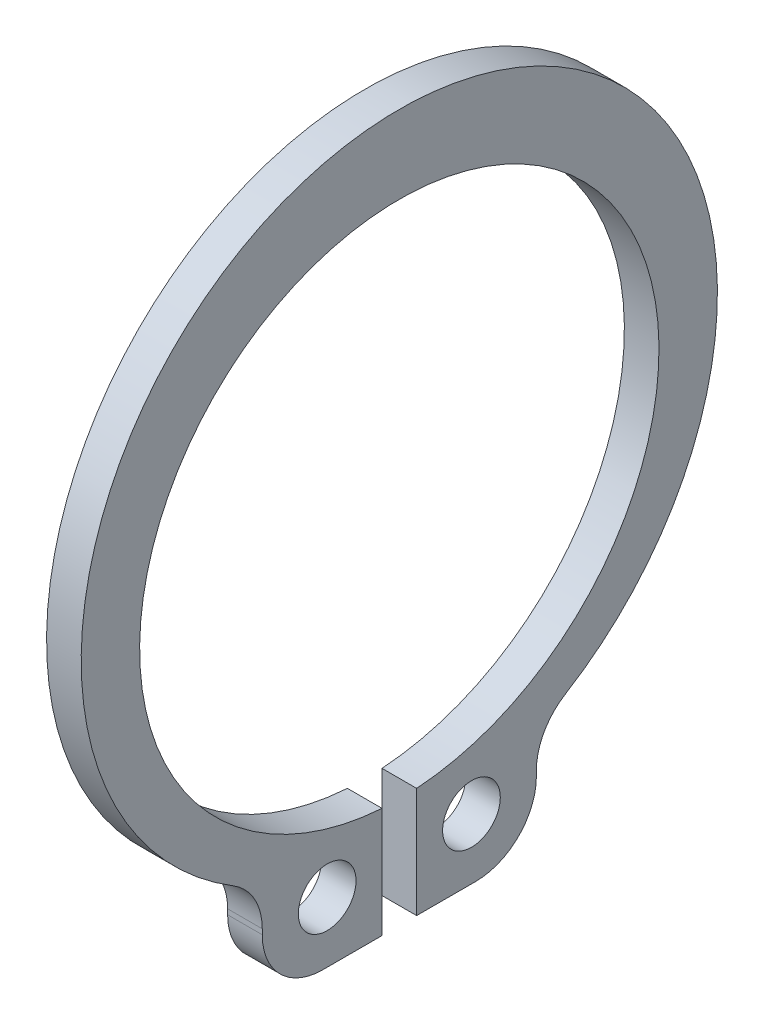
ISO-10303-21;
HEADER;
FILE_DESCRIPTION(('STEP AP214'),'2;1');
FILE_NAME('part.step','',(''),(''),'','','');
FILE_SCHEMA(('AUTOMOTIVE_DESIGN { 1 0 10303 214 1 1 1 1 }'));
ENDSEC;
DATA;
#1=APPLICATION_CONTEXT('core data for automotive mechanical design processes');
#2=APPLICATION_PROTOCOL_DEFINITION('international standard','automotive_design',2000,#1);
#3=PRODUCT_CONTEXT('',#1,'mechanical');
#4=PRODUCT('Part','Part','',(#3));
#5=PRODUCT_RELATED_PRODUCT_CATEGORY('part','',(#4));
#6=PRODUCT_DEFINITION_FORMATION('','',#4);
#7=PRODUCT_DEFINITION_CONTEXT('part definition',#1,'design');
#8=PRODUCT_DEFINITION('design','',#6,#7);
#9=PRODUCT_DEFINITION_SHAPE('','',#8);
#10=(LENGTH_UNIT() NAMED_UNIT(*) SI_UNIT(.MILLI.,.METRE.));
#11=(NAMED_UNIT(*) PLANE_ANGLE_UNIT() SI_UNIT($,.RADIAN.));
#12=(NAMED_UNIT(*) SI_UNIT($,.STERADIAN.) SOLID_ANGLE_UNIT());
#13=UNCERTAINTY_MEASURE_WITH_UNIT(LENGTH_MEASURE(1.E-05),#10,'distance_accuracy_value','');
#14=(GEOMETRIC_REPRESENTATION_CONTEXT(3) GLOBAL_UNCERTAINTY_ASSIGNED_CONTEXT((#13)) GLOBAL_UNIT_ASSIGNED_CONTEXT((#10,
#11,#12)) REPRESENTATION_CONTEXT('',''));
#15=CARTESIAN_POINT('',(0.,0.,0.));
#16=DIRECTION('',(0.,0.,1.));
#17=DIRECTION('',(1.,0.,0.));
#18=AXIS2_PLACEMENT_3D('',#15,#16,#17);
#19=CARTESIAN_POINT('',(0.6,-10.5206743879055,-6.85000000000033));
#20=DIRECTION('',(-1.,0.,0.));
#21=DIRECTION('',(0.,0.,1.));
#22=AXIS2_PLACEMENT_3D('',#19,#20,#21);
#23=CYLINDRICAL_SURFACE('',#22,2.10000000000033);
#24=CARTESIAN_POINT('',(-0.6,-10.5206743879055,-6.85000000000033));
#25=DIRECTION('',(-1.,0.,0.));
#26=DIRECTION('',(0.,1.1926967350257E-13,1.));
#27=AXIS2_PLACEMENT_3D('',#24,#25,#26);
#28=CIRCLE('',#27,2.10000000000033);
#29=CARTESIAN_POINT('',(-0.6,-8.72936650783709,-5.7539999640486));
#30=VERTEX_POINT('',#29);
#31=CARTESIAN_POINT('',(-0.6,-10.5206743879052,-4.75));
#32=VERTEX_POINT('',#31);
#33=EDGE_CURVE('E107',#30,#32,#28,.F.);
#34=ORIENTED_EDGE('',*,*,#33,.F.);
#35=DIRECTION('',(1.,0.,0.));
#36=VECTOR('',#35,1.);
#37=CARTESIAN_POINT('',(-0.6,-8.72936650783709,-5.7539999640486));
#38=LINE('',#37,#36);
#39=CARTESIAN_POINT('',(0.6,-8.72936650783709,-5.75399996404859));
#40=VERTEX_POINT('',#39);
#41=EDGE_CURVE('E119',#40,#30,#38,.F.);
#42=ORIENTED_EDGE('',*,*,#41,.F.);
#43=CARTESIAN_POINT('',(0.6,-10.5206743879055,-6.85000000000033));
#44=DIRECTION('',(1.,0.,0.));
#45=DIRECTION('',(0.,0.853003752413393,0.521904779024556));
#46=AXIS2_PLACEMENT_3D('',#43,#44,#45);
#47=CIRCLE('',#46,2.10000000000033);
#48=CARTESIAN_POINT('',(0.6,-10.5206743879052,-4.75));
#49=VERTEX_POINT('',#48);
#50=EDGE_CURVE('E124',#40,#49,#47,.T.);
#51=ORIENTED_EDGE('',*,*,#50,.T.);
#52=DIRECTION('',(-1.,0.,0.));
#53=VECTOR('',#52,1.);
#54=CARTESIAN_POINT('',(0.6,-10.5206743879052,-4.75));
#55=LINE('',#54,#53);
#56=EDGE_CURVE('E121',#49,#32,#55,.T.);
#57=ORIENTED_EDGE('',*,*,#56,.T.);
#58=EDGE_LOOP('',(#34,#42,#51,#57));
#59=FACE_BOUND('',#58,.T.);
#60=ADVANCED_FACE('F17',(#59),#23,.F.);
#61=CARTESIAN_POINT('',(-0.6,-10.7000000000002,-4.75));
#62=DIRECTION('',(0.,0.,-1.));
#63=DIRECTION('',(0.,1.,0.));
#64=AXIS2_PLACEMENT_3D('',#61,#62,#63);
#65=PLANE('',#64);
#66=DIRECTION('',(0.,1.,0.));
#67=VECTOR('',#66,1.);
#68=CARTESIAN_POINT('',(-0.6,-10.7000000000001,-4.75));
#69=LINE('',#68,#67);
#70=CARTESIAN_POINT('',(-0.6,-10.7000000000001,-4.75));
#71=VERTEX_POINT('',#70);
#72=EDGE_CURVE('E135',#71,#32,#69,.T.);
#73=ORIENTED_EDGE('',*,*,#72,.T.);
#74=ORIENTED_EDGE('',*,*,#56,.F.);
#75=DIRECTION('',(0.,-1.,0.));
#76=VECTOR('',#75,1.);
#77=CARTESIAN_POINT('',(0.6,-10.5206743879052,-4.75));
#78=LINE('',#77,#76);
#79=CARTESIAN_POINT('',(0.6,-10.7000000000002,-4.75));
#80=VERTEX_POINT('',#79);
#81=EDGE_CURVE('E139',#80,#49,#78,.F.);
#82=ORIENTED_EDGE('',*,*,#81,.F.);
#83=DIRECTION('',(-1.,0.,0.));
#84=VECTOR('',#83,1.);
#85=CARTESIAN_POINT('',(0.6,-10.7000000000002,-4.75));
#86=LINE('',#85,#84);
#87=EDGE_CURVE('E143',#80,#71,#86,.T.);
#88=ORIENTED_EDGE('',*,*,#87,.T.);
#89=EDGE_LOOP('',(#73,#74,#82,#88));
#90=FACE_BOUND('',#89,.T.);
#91=ADVANCED_FACE('F298',(#90),#65,.T.);
#92=CARTESIAN_POINT('',(0.6,-10.7000000000003,-2.65000000000035));
#93=DIRECTION('',(-1.,0.,0.));
#94=DIRECTION('',(0.,1.61770937065338E-13,-1.));
#95=AXIS2_PLACEMENT_3D('',#92,#93,#94);
#96=CYLINDRICAL_SURFACE('',#95,2.09999999999966);
#97=CARTESIAN_POINT('',(-0.6,-10.7000000000003,-2.65000000000035));
#98=DIRECTION('',(1.,0.,0.));
#99=DIRECTION('',(0.,-1.,1.64947420801479E-13));
#100=AXIS2_PLACEMENT_3D('',#97,#98,#99);
#101=CIRCLE('',#100,2.09999999999966);
#102=CARTESIAN_POINT('',(-0.6,-12.8,-2.65));
#103=VERTEX_POINT('',#102);
#104=EDGE_CURVE('E148',#103,#71,#101,.T.);
#105=ORIENTED_EDGE('',*,*,#104,.T.);
#106=ORIENTED_EDGE('',*,*,#87,.F.);
#107=CARTESIAN_POINT('',(0.6,-10.7000000000003,-2.65000000000035));
#108=DIRECTION('',(-1.,0.,0.));
#109=DIRECTION('',(0.,0.,-1.));
#110=AXIS2_PLACEMENT_3D('',#107,#108,#109);
#111=CIRCLE('',#110,2.09999999999966);
#112=CARTESIAN_POINT('',(0.6,-12.8,-2.65));
#113=VERTEX_POINT('',#112);
#114=EDGE_CURVE('E153',#113,#80,#111,.F.);
#115=ORIENTED_EDGE('',*,*,#114,.F.);
#116=DIRECTION('',(-1.,0.,0.));
#117=VECTOR('',#116,1.);
#118=CARTESIAN_POINT('',(0.6,-12.8,-2.65));
#119=LINE('',#118,#117);
#120=EDGE_CURVE('E157',#113,#103,#119,.T.);
#121=ORIENTED_EDGE('',*,*,#120,.T.);
#122=EDGE_LOOP('',(#105,#106,#115,#121));
#123=FACE_BOUND('',#122,.T.);
#124=ADVANCED_FACE('F303',(#123),#96,.T.);
#125=CARTESIAN_POINT('',(-0.6,-12.8,-2.65));
#126=DIRECTION('',(0.,-1.,0.));
#127=DIRECTION('',(1.,0.,0.));
#128=AXIS2_PLACEMENT_3D('',#125,#126,#127);
#129=PLANE('',#128);
#130=DIRECTION('',(0.,0.,-1.));
#131=VECTOR('',#130,1.);
#132=CARTESIAN_POINT('',(-0.6,-12.8,-0.6));
#133=LINE('',#132,#131);
#134=CARTESIAN_POINT('',(-0.6,-12.8,-0.6));
#135=VERTEX_POINT('',#134);
#136=EDGE_CURVE('E162',#135,#103,#133,.T.);
#137=ORIENTED_EDGE('',*,*,#136,.T.);
#138=ORIENTED_EDGE('',*,*,#120,.F.);
#139=DIRECTION('',(0.,0.,1.));
#140=VECTOR('',#139,1.);
#141=CARTESIAN_POINT('',(0.6,-12.8,-2.65));
#142=LINE('',#141,#140);
#143=CARTESIAN_POINT('',(0.6,-12.8,-0.6));
#144=VERTEX_POINT('',#143);
#145=EDGE_CURVE('E167',#144,#113,#142,.F.);
#146=ORIENTED_EDGE('',*,*,#145,.F.);
#147=DIRECTION('',(-1.,0.,0.));
#148=VECTOR('',#147,1.);
#149=CARTESIAN_POINT('',(0.6,-12.8,-0.6));
#150=LINE('',#149,#148);
#151=EDGE_CURVE('E171',#144,#135,#150,.T.);
#152=ORIENTED_EDGE('',*,*,#151,.T.);
#153=EDGE_LOOP('',(#137,#138,#146,#152));
#154=FACE_BOUND('',#153,.T.);
#155=ADVANCED_FACE('F309',(#154),#129,.T.);
#156=CARTESIAN_POINT('',(0.6,-12.8,-0.6));
#157=DIRECTION('',(0.,0.,1.));
#158=DIRECTION('',(0.,1.,0.));
#159=AXIS2_PLACEMENT_3D('',#156,#157,#158);
#160=PLANE('',#159);
#161=DIRECTION('',(0.,-1.,0.));
#162=VECTOR('',#161,1.);
#163=CARTESIAN_POINT('',(-0.6,-8.97997772825748,-0.6));
#164=LINE('',#163,#162);
#165=CARTESIAN_POINT('',(-0.6,-8.97997772825748,-0.6));
#166=VERTEX_POINT('',#165);
#167=EDGE_CURVE('E176',#166,#135,#164,.T.);
#168=ORIENTED_EDGE('',*,*,#167,.T.);
#169=ORIENTED_EDGE('',*,*,#151,.F.);
#170=DIRECTION('',(0.,1.,0.));
#171=VECTOR('',#170,1.);
#172=CARTESIAN_POINT('',(0.6,-12.8,-0.6));
#173=LINE('',#172,#171);
#174=CARTESIAN_POINT('',(0.6,-8.9799777282575,-0.6));
#175=VERTEX_POINT('',#174);
#176=EDGE_CURVE('E181',#175,#144,#173,.F.);
#177=ORIENTED_EDGE('',*,*,#176,.F.);
#178=DIRECTION('',(-1.,0.,0.));
#179=VECTOR('',#178,1.);
#180=CARTESIAN_POINT('',(0.6,-8.9799777282575,-0.6));
#181=LINE('',#180,#179);
#182=EDGE_CURVE('E185',#175,#166,#181,.T.);
#183=ORIENTED_EDGE('',*,*,#182,.T.);
#184=EDGE_LOOP('',(#168,#169,#177,#183));
#185=FACE_BOUND('',#184,.T.);
#186=ADVANCED_FACE('F313',(#185),#160,.T.);
#187=CARTESIAN_POINT('',(0.6,0.,0.));
#188=DIRECTION('',(-1.,0.,0.));
#189=DIRECTION('',(0.,-0.997775303139718,0.0666666666666656));
#190=AXIS2_PLACEMENT_3D('',#187,#188,#189);
#191=CYLINDRICAL_SURFACE('',#190,9.);
#192=DIRECTION('',(-1.,0.,0.));
#193=VECTOR('',#192,1.);
#194=CARTESIAN_POINT('',(0.6,-8.97997772825748,0.6));
#195=LINE('',#194,#193);
#196=CARTESIAN_POINT('',(0.6,-8.97997772825748,0.59999999999999));
#197=VERTEX_POINT('',#196);
#198=CARTESIAN_POINT('',(-0.6,-8.97997772825748,0.6));
#199=VERTEX_POINT('',#198);
#200=EDGE_CURVE('E190',#197,#199,#195,.T.);
#201=ORIENTED_EDGE('',*,*,#200,.T.);
#202=CARTESIAN_POINT('',(-0.6,0.,0.));
#203=DIRECTION('',(-1.,0.,0.));
#204=DIRECTION('',(0.,-0.997775303139718,0.0666666666666656));
#205=AXIS2_PLACEMENT_3D('',#202,#203,#204);
#206=CIRCLE('',#205,9.);
#207=EDGE_CURVE('E195',#166,#199,#206,.F.);
#208=ORIENTED_EDGE('',*,*,#207,.F.);
#209=ORIENTED_EDGE('',*,*,#182,.F.);
#210=CARTESIAN_POINT('',(0.6,0.,0.));
#211=DIRECTION('',(1.,0.,0.));
#212=DIRECTION('',(0.,-0.997775303139718,-0.0666666666666657));
#213=AXIS2_PLACEMENT_3D('',#210,#211,#212);
#214=CIRCLE('',#213,9.);
#215=EDGE_CURVE('E199',#175,#197,#214,.T.);
#216=ORIENTED_EDGE('',*,*,#215,.T.);
#217=EDGE_LOOP('',(#201,#208,#209,#216));
#218=FACE_BOUND('',#217,.T.);
#219=ADVANCED_FACE('F317',(#218),#191,.F.);
#220=CARTESIAN_POINT('',(-0.6,-12.8,0.6));
#221=DIRECTION('',(0.,0.,-1.));
#222=DIRECTION('',(0.,1.,0.));
#223=AXIS2_PLACEMENT_3D('',#220,#221,#222);
#224=PLANE('',#223);
#225=DIRECTION('',(0.,1.,0.));
#226=VECTOR('',#225,1.);
#227=CARTESIAN_POINT('',(-0.6,-12.8,0.6));
#228=LINE('',#227,#226);
#229=CARTESIAN_POINT('',(-0.6,-12.8,0.6));
#230=VERTEX_POINT('',#229);
#231=EDGE_CURVE('E204',#230,#199,#228,.T.);
#232=ORIENTED_EDGE('',*,*,#231,.T.);
#233=ORIENTED_EDGE('',*,*,#200,.F.);
#234=DIRECTION('',(0.,-1.,0.));
#235=VECTOR('',#234,1.);
#236=CARTESIAN_POINT('',(0.6,-8.97997772825748,0.6));
#237=LINE('',#236,#235);
#238=CARTESIAN_POINT('',(0.6,-12.8,0.6));
#239=VERTEX_POINT('',#238);
#240=EDGE_CURVE('E209',#239,#197,#237,.F.);
#241=ORIENTED_EDGE('',*,*,#240,.F.);
#242=DIRECTION('',(-1.,0.,0.));
#243=VECTOR('',#242,1.);
#244=CARTESIAN_POINT('',(0.6,-12.8,0.6));
#245=LINE('',#244,#243);
#246=EDGE_CURVE('E213',#239,#230,#245,.T.);
#247=ORIENTED_EDGE('',*,*,#246,.T.);
#248=EDGE_LOOP('',(#232,#233,#241,#247));
#249=FACE_BOUND('',#248,.T.);
#250=ADVANCED_FACE('F321',(#249),#224,.T.);
#251=CARTESIAN_POINT('',(-0.6,-12.8,0.6));
#252=DIRECTION('',(0.,-1.,0.));
#253=DIRECTION('',(1.,0.,0.));
#254=AXIS2_PLACEMENT_3D('',#251,#252,#253);
#255=PLANE('',#254);
#256=DIRECTION('',(0.,0.,-1.));
#257=VECTOR('',#256,1.);
#258=CARTESIAN_POINT('',(-0.6,-12.8,2.65000000000009));
#259=LINE('',#258,#257);
#260=CARTESIAN_POINT('',(-0.6,-12.8,2.65000000000009));
#261=VERTEX_POINT('',#260);
#262=EDGE_CURVE('E218',#261,#230,#259,.T.);
#263=ORIENTED_EDGE('',*,*,#262,.T.);
#264=ORIENTED_EDGE('',*,*,#246,.F.);
#265=DIRECTION('',(0.,0.,1.));
#266=VECTOR('',#265,1.);
#267=CARTESIAN_POINT('',(0.6,-12.8,0.6));
#268=LINE('',#267,#266);
#269=CARTESIAN_POINT('',(0.6,-12.8,2.65000000000011));
#270=VERTEX_POINT('',#269);
#271=EDGE_CURVE('E223',#270,#239,#268,.F.);
#272=ORIENTED_EDGE('',*,*,#271,.F.);
#273=DIRECTION('',(-1.,0.,0.));
#274=VECTOR('',#273,1.);
#275=CARTESIAN_POINT('',(0.6,-12.8,2.65000000000011));
#276=LINE('',#275,#274);
#277=EDGE_CURVE('E227',#270,#261,#276,.T.);
#278=ORIENTED_EDGE('',*,*,#277,.T.);
#279=EDGE_LOOP('',(#263,#264,#272,#278));
#280=FACE_BOUND('',#279,.T.);
#281=ADVANCED_FACE('F325',(#280),#255,.T.);
#282=CARTESIAN_POINT('',(0.6,-10.7000000000003,2.65000000000035));
#283=DIRECTION('',(-1.,0.,0.));
#284=DIRECTION('',(0.,-1.,-1.2364049735819E-13));
#285=AXIS2_PLACEMENT_3D('',#282,#283,#284);
#286=CYLINDRICAL_SURFACE('',#285,2.09999999999966);
#287=CARTESIAN_POINT('',(-0.6,-10.7000000000003,2.65000000000035));
#288=DIRECTION('',(1.,0.,0.));
#289=DIRECTION('',(0.,0.,1.));
#290=AXIS2_PLACEMENT_3D('',#287,#288,#289);
#291=CIRCLE('',#290,2.09999999999966);
#292=CARTESIAN_POINT('',(-0.6,-10.7000000000002,4.75));
#293=VERTEX_POINT('',#292);
#294=EDGE_CURVE('E232',#293,#261,#291,.T.);
#295=ORIENTED_EDGE('',*,*,#294,.T.);
#296=ORIENTED_EDGE('',*,*,#277,.F.);
#297=CARTESIAN_POINT('',(0.6,-10.7000000000003,2.65000000000035));
#298=DIRECTION('',(-1.,0.,0.));
#299=DIRECTION('',(0.,-1.,-1.12079657724082E-13));
#300=AXIS2_PLACEMENT_3D('',#297,#298,#299);
#301=CIRCLE('',#300,2.09999999999966);
#302=CARTESIAN_POINT('',(0.6,-10.7000000000002,4.75));
#303=VERTEX_POINT('',#302);
#304=EDGE_CURVE('E237',#303,#270,#301,.F.);
#305=ORIENTED_EDGE('',*,*,#304,.F.);
#306=DIRECTION('',(-1.,0.,0.));
#307=VECTOR('',#306,1.);
#308=CARTESIAN_POINT('',(0.6,-10.7000000000002,4.75));
#309=LINE('',#308,#307);
#310=EDGE_CURVE('E241',#303,#293,#309,.T.);
#311=ORIENTED_EDGE('',*,*,#310,.T.);
#312=EDGE_LOOP('',(#295,#296,#305,#311));
#313=FACE_BOUND('',#312,.T.);
#314=ADVANCED_FACE('F329',(#313),#286,.T.);
#315=CARTESIAN_POINT('',(0.6,-10.7000000000002,4.75));
#316=DIRECTION('',(0.,0.,1.));
#317=DIRECTION('',(0.,1.,0.));
#318=AXIS2_PLACEMENT_3D('',#315,#316,#317);
#319=PLANE('',#318);
#320=DIRECTION('',(0.,-1.,0.));
#321=VECTOR('',#320,1.);
#322=CARTESIAN_POINT('',(-0.6,-10.5206743879051,4.75));
#323=LINE('',#322,#321);
#324=CARTESIAN_POINT('',(-0.6,-10.5206743879051,4.75));
#325=VERTEX_POINT('',#324);
#326=EDGE_CURVE('E246',#325,#293,#323,.T.);
#327=ORIENTED_EDGE('',*,*,#326,.T.);
#328=ORIENTED_EDGE('',*,*,#310,.F.);
#329=DIRECTION('',(0.,1.,0.));
#330=VECTOR('',#329,1.);
#331=CARTESIAN_POINT('',(0.6,-10.7000000000002,4.75));
#332=LINE('',#331,#330);
#333=CARTESIAN_POINT('',(0.6,-10.5206743879052,4.75));
#334=VERTEX_POINT('',#333);
#335=EDGE_CURVE('E251',#334,#303,#332,.F.);
#336=ORIENTED_EDGE('',*,*,#335,.F.);
#337=DIRECTION('',(-1.,0.,0.));
#338=VECTOR('',#337,1.);
#339=CARTESIAN_POINT('',(0.6,-10.5206743879052,4.75));
#340=LINE('',#339,#338);
#341=EDGE_CURVE('E255',#334,#325,#340,.T.);
#342=ORIENTED_EDGE('',*,*,#341,.T.);
#343=EDGE_LOOP('',(#327,#328,#336,#342));
#344=FACE_BOUND('',#343,.T.);
#345=ADVANCED_FACE('F333',(#344),#319,.T.);
#346=CARTESIAN_POINT('',(0.6,-10.5206743879055,6.85000000000024));
#347=DIRECTION('',(-1.,0.,0.));
#348=DIRECTION('',(0.,0.853003762887995,-0.521904761904815));
#349=AXIS2_PLACEMENT_3D('',#346,#347,#348);
#350=CYLINDRICAL_SURFACE('',#349,2.10000000000024);
#351=CARTESIAN_POINT('',(-0.6,-10.5206743879055,6.85000000000024));
#352=DIRECTION('',(-1.,0.,0.));
#353=DIRECTION('',(0.,0.853003762887995,-0.521904761904815));
#354=AXIS2_PLACEMENT_3D('',#351,#352,#353);
#355=CIRCLE('',#354,2.10000000000024);
#356=CARTESIAN_POINT('',(-0.6,-8.7293664858405,5.754));
#357=VERTEX_POINT('',#356);
#358=EDGE_CURVE('E32',#325,#357,#355,.F.);
#359=ORIENTED_EDGE('',*,*,#358,.F.);
#360=ORIENTED_EDGE('',*,*,#341,.F.);
#361=CARTESIAN_POINT('',(0.6,-10.5206743879055,6.85000000000024));
#362=DIRECTION('',(1.,0.,0.));
#363=DIRECTION('',(0.,1.27728515594956E-13,-1.));
#364=AXIS2_PLACEMENT_3D('',#361,#362,#363);
#365=CIRCLE('',#364,2.10000000000024);
#366=CARTESIAN_POINT('',(0.6,-8.7293664858405,5.754));
#367=VERTEX_POINT('',#366);
#368=EDGE_CURVE('E263',#334,#367,#365,.T.);
#369=ORIENTED_EDGE('',*,*,#368,.T.);
#370=DIRECTION('',(-1.,0.,0.));
#371=VECTOR('',#370,1.);
#372=CARTESIAN_POINT('',(0.6,-8.7293664858405,5.754));
#373=LINE('',#372,#371);
#374=EDGE_CURVE('E113',#367,#357,#373,.T.);
#375=ORIENTED_EDGE('',*,*,#374,.T.);
#376=EDGE_LOOP('',(#359,#360,#369,#375));
#377=FACE_BOUND('',#376,.T.);
#378=ADVANCED_FACE('F337',(#377),#350,.F.);
#379=CARTESIAN_POINT('',(0.6,0.675,0.));
#380=DIRECTION('',(-1.,0.,0.));
#381=DIRECTION('',(0.,1.,-1.91141829569342E-09));
#382=AXIS2_PLACEMENT_3D('',#379,#380,#381);
#383=CYLINDRICAL_SURFACE('',#382,11.025);
#384=ORIENTED_EDGE('',*,*,#41,.T.);
#385=CARTESIAN_POINT('',(-0.6,0.675,0.));
#386=DIRECTION('',(1.,0.,0.));
#387=DIRECTION('',(0.,-0.853003764883185,-0.521904758643866));
#388=AXIS2_PLACEMENT_3D('',#385,#386,#387);
#389=CIRCLE('',#388,11.025);
#390=EDGE_CURVE('E103',#30,#357,#389,.T.);
#391=ORIENTED_EDGE('',*,*,#390,.T.);
#392=ORIENTED_EDGE('',*,*,#374,.F.);
#393=CARTESIAN_POINT('',(0.6,0.675,0.));
#394=DIRECTION('',(-1.,0.,0.));
#395=DIRECTION('',(0.,-0.853003762888028,0.52190476190476));
#396=AXIS2_PLACEMENT_3D('',#393,#394,#395);
#397=CIRCLE('',#396,11.025);
#398=EDGE_CURVE('E40',#40,#367,#397,.F.);
#399=ORIENTED_EDGE('',*,*,#398,.F.);
#400=EDGE_LOOP('',(#384,#391,#392,#399));
#401=FACE_BOUND('',#400,.T.);
#402=ADVANCED_FACE('F123',(#401),#383,.T.);
#403=CARTESIAN_POINT('',(0.6,-12.8000000000001,11.2639087918988));
#404=DIRECTION('',(1.,0.,0.));
#405=DIRECTION('',(0.,0.,-1.));
#406=AXIS2_PLACEMENT_3D('',#403,#404,#405);
#407=PLANE('',#406);
#408=ORIENTED_EDGE('',*,*,#50,.F.);
#409=ORIENTED_EDGE('',*,*,#398,.T.);
#410=ORIENTED_EDGE('',*,*,#368,.F.);
#411=ORIENTED_EDGE('',*,*,#335,.T.);
#412=ORIENTED_EDGE('',*,*,#304,.T.);
#413=ORIENTED_EDGE('',*,*,#271,.T.);
#414=ORIENTED_EDGE('',*,*,#240,.T.);
#415=ORIENTED_EDGE('',*,*,#215,.F.);
#416=ORIENTED_EDGE('',*,*,#176,.T.);
#417=ORIENTED_EDGE('',*,*,#145,.T.);
#418=ORIENTED_EDGE('',*,*,#114,.T.);
#419=ORIENTED_EDGE('',*,*,#81,.T.);
#420=EDGE_LOOP('',(#408,#409,#410,#411,#412,#413,#414,#415,#416,#417,#418,#419));
#421=FACE_BOUND('',#420,.T.);
#422=CARTESIAN_POINT('',(0.6,-10.7,-2.5));
#423=DIRECTION('',(-1.,0.,0.));
#424=DIRECTION('',(0.,-1.42053909968358E-07,-0.99999999999999));
#425=AXIS2_PLACEMENT_3D('',#422,#423,#424);
#426=CIRCLE('',#425,1.);
#427=CARTESIAN_POINT('',(0.6,-10.7000001420539,-3.49999999999999));
#428=VERTEX_POINT('',#427);
#429=EDGE_CURVE('E275',#428,#428,#426,.F.);
#430=ORIENTED_EDGE('',*,*,#429,.F.);
#431=EDGE_LOOP('',(#430));
#432=FACE_BOUND('',#431,.T.);
#433=CARTESIAN_POINT('',(0.6,-10.7,2.5));
#434=DIRECTION('',(-1.,0.,0.));
#435=DIRECTION('',(0.,-1.42053885099362E-07,-0.99999999999999));
#436=AXIS2_PLACEMENT_3D('',#433,#434,#435);
#437=CIRCLE('',#436,1.);
#438=CARTESIAN_POINT('',(0.6,-10.7000001420539,1.50000000000001));
#439=VERTEX_POINT('',#438);
#440=EDGE_CURVE('E280',#439,#439,#437,.F.);
#441=ORIENTED_EDGE('',*,*,#440,.F.);
#442=EDGE_LOOP('',(#441));
#443=FACE_BOUND('',#442,.T.);
#444=ADVANCED_FACE('F295',(#421,#432,#443),#407,.T.);
#445=CARTESIAN_POINT('',(-0.6,-12.8,11.2639087918988));
#446=DIRECTION('',(-1.,0.,0.));
#447=DIRECTION('',(0.,1.,0.));
#448=AXIS2_PLACEMENT_3D('',#445,#446,#447);
#449=PLANE('',#448);
#450=ORIENTED_EDGE('',*,*,#390,.F.);
#451=ORIENTED_EDGE('',*,*,#33,.T.);
#452=ORIENTED_EDGE('',*,*,#72,.F.);
#453=ORIENTED_EDGE('',*,*,#104,.F.);
#454=ORIENTED_EDGE('',*,*,#136,.F.);
#455=ORIENTED_EDGE('',*,*,#167,.F.);
#456=ORIENTED_EDGE('',*,*,#207,.T.);
#457=ORIENTED_EDGE('',*,*,#231,.F.);
#458=ORIENTED_EDGE('',*,*,#262,.F.);
#459=ORIENTED_EDGE('',*,*,#294,.F.);
#460=ORIENTED_EDGE('',*,*,#326,.F.);
#461=ORIENTED_EDGE('',*,*,#358,.T.);
#462=EDGE_LOOP('',(#450,#451,#452,#453,#454,#455,#456,#457,#458,#459,#460,#461));
#463=FACE_BOUND('',#462,.T.);
#464=CARTESIAN_POINT('',(-0.6,-10.7,-2.5));
#465=DIRECTION('',(1.,0.,0.));
#466=DIRECTION('',(0.,-1.42053909968359E-07,0.99999999999999));
#467=AXIS2_PLACEMENT_3D('',#464,#465,#466);
#468=CIRCLE('',#467,1.);
#469=CARTESIAN_POINT('',(-0.6,-10.7000001420539,-1.50000000000001));
#470=VERTEX_POINT('',#469);
#471=EDGE_CURVE('E25',#470,#470,#468,.T.);
#472=ORIENTED_EDGE('',*,*,#471,.T.);
#473=EDGE_LOOP('',(#472));
#474=FACE_BOUND('',#473,.T.);
#475=CARTESIAN_POINT('',(-0.6,-10.7,2.5));
#476=DIRECTION('',(1.,0.,0.));
#477=DIRECTION('',(0.,0.,1.));
#478=AXIS2_PLACEMENT_3D('',#475,#476,#477);
#479=CIRCLE('',#478,1.);
#480=CARTESIAN_POINT('',(-0.6,-10.7,3.5));
#481=VERTEX_POINT('',#480);
#482=EDGE_CURVE('E11',#481,#481,#479,.T.);
#483=ORIENTED_EDGE('',*,*,#482,.T.);
#484=EDGE_LOOP('',(#483));
#485=FACE_BOUND('',#484,.T.);
#486=ADVANCED_FACE('F105',(#463,#474,#485),#449,.T.);
#487=CARTESIAN_POINT('',(0.6,-10.7,-2.5));
#488=DIRECTION('',(-1.,0.,0.));
#489=DIRECTION('',(0.,0.,-1.));
#490=AXIS2_PLACEMENT_3D('',#487,#488,#489);
#491=CYLINDRICAL_SURFACE('',#490,1.);
#492=ORIENTED_EDGE('',*,*,#429,.T.);
#493=EDGE_LOOP('',(#492));
#494=FACE_BOUND('',#493,.T.);
#495=ORIENTED_EDGE('',*,*,#471,.F.);
#496=EDGE_LOOP('',(#495));
#497=FACE_BOUND('',#496,.T.);
#498=ADVANCED_FACE('F286',(#494,#497),#491,.F.);
#499=CARTESIAN_POINT('',(0.6,-10.7,2.5));
#500=DIRECTION('',(-1.,0.,0.));
#501=DIRECTION('',(0.,1.42053885221822E-07,-0.99999999999999));
#502=AXIS2_PLACEMENT_3D('',#499,#500,#501);
#503=CYLINDRICAL_SURFACE('',#502,1.);
#504=ORIENTED_EDGE('',*,*,#440,.T.);
#505=EDGE_LOOP('',(#504));
#506=FACE_BOUND('',#505,.T.);
#507=ORIENTED_EDGE('',*,*,#482,.F.);
#508=EDGE_LOOP('',(#507));
#509=FACE_BOUND('',#508,.T.);
#510=ADVANCED_FACE('F19',(#506,#509),#503,.F.);
#511=CLOSED_SHELL('',(#60,#91,#124,#155,#186,#219,#250,#281,#314,#345,#378,#402,#444,#486,#498,#510));
#512=MANIFOLD_SOLID_BREP('B1',#511);
#513=ADVANCED_BREP_SHAPE_REPRESENTATION('',(#18,#512),#14);
#514=SHAPE_DEFINITION_REPRESENTATION(#9,#513);
ENDSEC;
END-ISO-10303-21;
